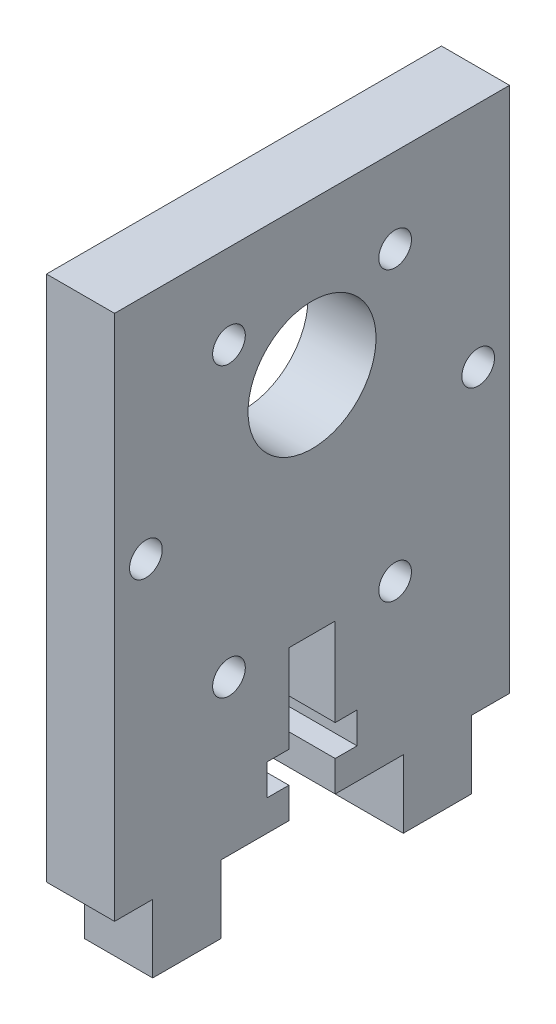
ISO-10303-21;
HEADER;
FILE_DESCRIPTION(('STEP AP214'),'2;1');
FILE_NAME('part.step','',(''),(''),'','','');
FILE_SCHEMA(('AUTOMOTIVE_DESIGN { 1 0 10303 214 1 1 1 1 }'));
ENDSEC;
DATA;
#1=APPLICATION_CONTEXT('core data for automotive mechanical design processes');
#2=APPLICATION_PROTOCOL_DEFINITION('international standard','automotive_design',2000,#1);
#3=PRODUCT_CONTEXT('',#1,'mechanical');
#4=PRODUCT('Part','Part','',(#3));
#5=PRODUCT_RELATED_PRODUCT_CATEGORY('part','',(#4));
#6=PRODUCT_DEFINITION_FORMATION('','',#4);
#7=PRODUCT_DEFINITION_CONTEXT('part definition',#1,'design');
#8=PRODUCT_DEFINITION('design','',#6,#7);
#9=PRODUCT_DEFINITION_SHAPE('','',#8);
#10=(LENGTH_UNIT() NAMED_UNIT(*) SI_UNIT(.MILLI.,.METRE.));
#11=(NAMED_UNIT(*) PLANE_ANGLE_UNIT() SI_UNIT($,.RADIAN.));
#12=(NAMED_UNIT(*) SI_UNIT($,.STERADIAN.) SOLID_ANGLE_UNIT());
#13=UNCERTAINTY_MEASURE_WITH_UNIT(LENGTH_MEASURE(1.E-05),#10,'distance_accuracy_value','');
#14=(GEOMETRIC_REPRESENTATION_CONTEXT(3) GLOBAL_UNCERTAINTY_ASSIGNED_CONTEXT((#13)) GLOBAL_UNIT_ASSIGNED_CONTEXT((#10,
#11,#12)) REPRESENTATION_CONTEXT('',''));
#15=CARTESIAN_POINT('',(0.,0.,0.));
#16=DIRECTION('',(0.,0.,1.));
#17=DIRECTION('',(1.,0.,0.));
#18=AXIS2_PLACEMENT_3D('',#15,#16,#17);
#19=CARTESIAN_POINT('',(6.35,-24.5525988031179,0.));
#20=DIRECTION('',(0.,-1.,0.));
#21=DIRECTION('',(0.,0.,-1.));
#22=AXIS2_PLACEMENT_3D('',#19,#20,#21);
#23=PLANE('',#22);
#24=DIRECTION('',(0.,0.,1.));
#25=VECTOR('',#24,1.);
#26=CARTESIAN_POINT('',(0.,-24.5525988031179,0.));
#27=LINE('',#26,#25);
#28=CARTESIAN_POINT('',(0.,-24.5525988031179,-8.50899999999945));
#29=VERTEX_POINT('',#28);
#30=CARTESIAN_POINT('',(0.,-24.5525988031179,-2.15899999999948));
#31=VERTEX_POINT('',#30);
#32=EDGE_CURVE('E288',#29,#31,#27,.T.);
#33=ORIENTED_EDGE('',*,*,#32,.F.);
#34=DIRECTION('',(-1.,0.,0.));
#35=VECTOR('',#34,1.);
#36=CARTESIAN_POINT('',(6.35,-24.5525988031179,-8.50899999999945));
#37=LINE('',#36,#35);
#38=CARTESIAN_POINT('',(6.35,-24.5525988031179,-8.50899999999945));
#39=VERTEX_POINT('',#38);
#40=EDGE_CURVE('E11',#39,#29,#37,.T.);
#41=ORIENTED_EDGE('',*,*,#40,.F.);
#42=DIRECTION('',(0.,0.,1.));
#43=VECTOR('',#42,1.);
#44=CARTESIAN_POINT('',(6.35,-24.5525988031179,0.));
#45=LINE('',#44,#43);
#46=CARTESIAN_POINT('',(6.35,-24.5525988031179,-2.15899999999948));
#47=VERTEX_POINT('',#46);
#48=EDGE_CURVE('E510',#39,#47,#45,.T.);
#49=ORIENTED_EDGE('',*,*,#48,.T.);
#50=DIRECTION('',(-1.,0.,0.));
#51=VECTOR('',#50,1.);
#52=CARTESIAN_POINT('',(6.35,-24.5525988031179,-2.15899999999948));
#53=LINE('',#52,#51);
#54=EDGE_CURVE('E133',#47,#31,#53,.T.);
#55=ORIENTED_EDGE('',*,*,#54,.T.);
#56=EDGE_LOOP('',(#33,#41,#49,#55));
#57=FACE_BOUND('',#56,.T.);
#58=ADVANCED_FACE('F34',(#57),#23,.T.);
#59=CARTESIAN_POINT('',(6.35,0.,-8.50899999999945));
#60=DIRECTION('',(0.,0.,-1.));
#61=DIRECTION('',(0.,1.,0.));
#62=AXIS2_PLACEMENT_3D('',#59,#60,#61);
#63=PLANE('',#62);
#64=DIRECTION('',(0.,-1.,0.));
#65=VECTOR('',#64,1.);
#66=CARTESIAN_POINT('',(0.,0.,-8.50899999999945));
#67=LINE('',#66,#65);
#68=CARTESIAN_POINT('',(0.,-30.9025988031179,-8.50899999999944));
#69=VERTEX_POINT('',#68);
#70=EDGE_CURVE('E286',#29,#69,#67,.T.);
#71=ORIENTED_EDGE('',*,*,#70,.T.);
#72=DIRECTION('',(-1.,0.,0.));
#73=VECTOR('',#72,1.);
#74=CARTESIAN_POINT('',(6.35,-30.9025988031179,-8.50899999999944));
#75=LINE('',#74,#73);
#76=CARTESIAN_POINT('',(6.35,-30.9025988031179,-8.50899999999944));
#77=VERTEX_POINT('',#76);
#78=EDGE_CURVE('E43',#77,#69,#75,.T.);
#79=ORIENTED_EDGE('',*,*,#78,.F.);
#80=DIRECTION('',(0.,-1.,0.));
#81=VECTOR('',#80,1.);
#82=CARTESIAN_POINT('',(6.35,0.,-8.50899999999945));
#83=LINE('',#82,#81);
#84=EDGE_CURVE('E512',#39,#77,#83,.T.);
#85=ORIENTED_EDGE('',*,*,#84,.F.);
#86=ORIENTED_EDGE('',*,*,#40,.T.);
#87=EDGE_LOOP('',(#71,#79,#85,#86));
#88=FACE_BOUND('',#87,.T.);
#89=ADVANCED_FACE('F287',(#88),#63,.F.);
#90=CARTESIAN_POINT('',(6.35,-30.9025988031179,0.));
#91=DIRECTION('',(0.,1.,0.));
#92=DIRECTION('',(0.,0.,1.));
#93=AXIS2_PLACEMENT_3D('',#90,#91,#92);
#94=PLANE('',#93);
#95=DIRECTION('',(0.,0.,-1.));
#96=VECTOR('',#95,1.);
#97=CARTESIAN_POINT('',(0.,-30.9025988031179,0.));
#98=LINE('',#97,#96);
#99=CARTESIAN_POINT('',(0.,-30.9025988031179,-14.8589999999995));
#100=VERTEX_POINT('',#99);
#101=EDGE_CURVE('E280',#69,#100,#98,.T.);
#102=ORIENTED_EDGE('',*,*,#101,.T.);
#103=DIRECTION('',(-1.,0.,0.));
#104=VECTOR('',#103,1.);
#105=CARTESIAN_POINT('',(6.35,-30.9025988031179,-14.8589999999995));
#106=LINE('',#105,#104);
#107=CARTESIAN_POINT('',(6.35,-30.9025988031179,-14.8589999999995));
#108=VERTEX_POINT('',#107);
#109=EDGE_CURVE('E271',#108,#100,#106,.T.);
#110=ORIENTED_EDGE('',*,*,#109,.F.);
#111=DIRECTION('',(0.,0.,-1.));
#112=VECTOR('',#111,1.);
#113=CARTESIAN_POINT('',(6.35,-30.9025988031179,0.));
#114=LINE('',#113,#112);
#115=EDGE_CURVE('E282',#77,#108,#114,.T.);
#116=ORIENTED_EDGE('',*,*,#115,.F.);
#117=ORIENTED_EDGE('',*,*,#78,.T.);
#118=EDGE_LOOP('',(#102,#110,#116,#117));
#119=FACE_BOUND('',#118,.T.);
#120=ADVANCED_FACE('F278',(#119),#94,.F.);
#121=CARTESIAN_POINT('',(6.35,0.,-14.8589999999995));
#122=DIRECTION('',(0.,0.,1.));
#123=DIRECTION('',(0.,-1.,0.));
#124=AXIS2_PLACEMENT_3D('',#121,#122,#123);
#125=PLANE('',#124);
#126=DIRECTION('',(0.,1.,0.));
#127=VECTOR('',#126,1.);
#128=CARTESIAN_POINT('',(0.,0.,-14.8589999999995));
#129=LINE('',#128,#127);
#130=CARTESIAN_POINT('',(0.,-24.5525988031179,-14.8589999999995));
#131=VERTEX_POINT('',#130);
#132=EDGE_CURVE('E290',#100,#131,#129,.T.);
#133=ORIENTED_EDGE('',*,*,#132,.T.);
#134=DIRECTION('',(-1.,0.,0.));
#135=VECTOR('',#134,1.);
#136=CARTESIAN_POINT('',(6.35,-24.5525988031179,-14.8589999999995));
#137=LINE('',#136,#135);
#138=CARTESIAN_POINT('',(6.35,-24.5525988031179,-14.8589999999995));
#139=VERTEX_POINT('',#138);
#140=EDGE_CURVE('E268',#139,#131,#137,.T.);
#141=ORIENTED_EDGE('',*,*,#140,.F.);
#142=DIRECTION('',(0.,1.,0.));
#143=VECTOR('',#142,1.);
#144=CARTESIAN_POINT('',(6.35,0.,-14.8589999999995));
#145=LINE('',#144,#143);
#146=EDGE_CURVE('E519',#108,#139,#145,.T.);
#147=ORIENTED_EDGE('',*,*,#146,.F.);
#148=ORIENTED_EDGE('',*,*,#109,.T.);
#149=EDGE_LOOP('',(#133,#141,#147,#148));
#150=FACE_BOUND('',#149,.T.);
#151=ADVANCED_FACE('F400',(#150),#125,.F.);
#152=CARTESIAN_POINT('',(6.35,-24.5525988031179,0.));
#153=DIRECTION('',(0.,1.,0.));
#154=DIRECTION('',(0.,0.,1.));
#155=AXIS2_PLACEMENT_3D('',#152,#153,#154);
#156=PLANE('',#155);
#157=DIRECTION('',(0.,0.,-1.));
#158=VECTOR('',#157,1.);
#159=CARTESIAN_POINT('',(0.,-24.5525988031179,0.));
#160=LINE('',#159,#158);
#161=CARTESIAN_POINT('',(0.,-24.5525988031179,-18.415));
#162=VERTEX_POINT('',#161);
#163=EDGE_CURVE('E298',#131,#162,#160,.T.);
#164=ORIENTED_EDGE('',*,*,#163,.T.);
#165=DIRECTION('',(-1.,0.,0.));
#166=VECTOR('',#165,1.);
#167=CARTESIAN_POINT('',(6.35,-24.5525988031179,-18.415));
#168=LINE('',#167,#166);
#169=CARTESIAN_POINT('',(6.35,-24.5525988031179,-18.415));
#170=VERTEX_POINT('',#169);
#171=EDGE_CURVE('E265',#170,#162,#168,.T.);
#172=ORIENTED_EDGE('',*,*,#171,.F.);
#173=DIRECTION('',(0.,0.,-1.));
#174=VECTOR('',#173,1.);
#175=CARTESIAN_POINT('',(6.35,-24.5525988031179,0.));
#176=LINE('',#175,#174);
#177=EDGE_CURVE('E522',#139,#170,#176,.T.);
#178=ORIENTED_EDGE('',*,*,#177,.F.);
#179=ORIENTED_EDGE('',*,*,#140,.T.);
#180=EDGE_LOOP('',(#164,#172,#178,#179));
#181=FACE_BOUND('',#180,.T.);
#182=ADVANCED_FACE('F403',(#181),#156,.F.);
#183=CARTESIAN_POINT('',(6.35,0.,-18.415));
#184=DIRECTION('',(0.,0.,1.));
#185=DIRECTION('',(0.,-1.,0.));
#186=AXIS2_PLACEMENT_3D('',#183,#184,#185);
#187=PLANE('',#186);
#188=DIRECTION('',(0.,1.,0.));
#189=VECTOR('',#188,1.);
#190=CARTESIAN_POINT('',(0.,0.,-18.415));
#191=LINE('',#190,#189);
#192=CARTESIAN_POINT('',(0.,24.5525988031181,-18.415));
#193=VERTEX_POINT('',#192);
#194=EDGE_CURVE('E301',#162,#193,#191,.T.);
#195=ORIENTED_EDGE('',*,*,#194,.T.);
#196=DIRECTION('',(-1.,0.,0.));
#197=VECTOR('',#196,1.);
#198=CARTESIAN_POINT('',(6.35,24.5525988031181,-18.415));
#199=LINE('',#198,#197);
#200=CARTESIAN_POINT('',(6.35,24.5525988031181,-18.415));
#201=VERTEX_POINT('',#200);
#202=EDGE_CURVE('E263',#201,#193,#199,.T.);
#203=ORIENTED_EDGE('',*,*,#202,.F.);
#204=DIRECTION('',(0.,1.,0.));
#205=VECTOR('',#204,1.);
#206=CARTESIAN_POINT('',(6.35,0.,-18.415));
#207=LINE('',#206,#205);
#208=EDGE_CURVE('E525',#170,#201,#207,.T.);
#209=ORIENTED_EDGE('',*,*,#208,.F.);
#210=ORIENTED_EDGE('',*,*,#171,.T.);
#211=EDGE_LOOP('',(#195,#203,#209,#210));
#212=FACE_BOUND('',#211,.T.);
#213=ADVANCED_FACE('F407',(#212),#187,.F.);
#214=CARTESIAN_POINT('',(6.35,24.5525988031181,0.));
#215=DIRECTION('',(0.,1.,0.));
#216=DIRECTION('',(0.,0.,1.));
#217=AXIS2_PLACEMENT_3D('',#214,#215,#216);
#218=PLANE('',#217);
#219=DIRECTION('',(0.,0.,-1.));
#220=VECTOR('',#219,1.);
#221=CARTESIAN_POINT('',(0.,24.5525988031181,0.));
#222=LINE('',#221,#220);
#223=CARTESIAN_POINT('',(0.,24.5525988031181,18.415));
#224=VERTEX_POINT('',#223);
#225=EDGE_CURVE('E304',#224,#193,#222,.T.);
#226=ORIENTED_EDGE('',*,*,#225,.F.);
#227=DIRECTION('',(-1.,0.,0.));
#228=VECTOR('',#227,1.);
#229=CARTESIAN_POINT('',(6.35,24.5525988031181,18.415));
#230=LINE('',#229,#228);
#231=CARTESIAN_POINT('',(6.35,24.5525988031181,18.415));
#232=VERTEX_POINT('',#231);
#233=EDGE_CURVE('E261',#232,#224,#230,.T.);
#234=ORIENTED_EDGE('',*,*,#233,.F.);
#235=DIRECTION('',(0.,0.,-1.));
#236=VECTOR('',#235,1.);
#237=CARTESIAN_POINT('',(6.35,24.5525988031181,0.));
#238=LINE('',#237,#236);
#239=EDGE_CURVE('E527',#232,#201,#238,.T.);
#240=ORIENTED_EDGE('',*,*,#239,.T.);
#241=ORIENTED_EDGE('',*,*,#202,.T.);
#242=EDGE_LOOP('',(#226,#234,#240,#241));
#243=FACE_BOUND('',#242,.T.);
#244=ADVANCED_FACE('F411',(#243),#218,.T.);
#245=CARTESIAN_POINT('',(6.35,0.,18.415));
#246=DIRECTION('',(0.,0.,1.));
#247=DIRECTION('',(1.,0.,0.));
#248=AXIS2_PLACEMENT_3D('',#245,#246,#247);
#249=PLANE('',#248);
#250=DIRECTION('',(0.,1.,0.));
#251=VECTOR('',#250,1.);
#252=CARTESIAN_POINT('',(0.,0.,18.415));
#253=LINE('',#252,#251);
#254=CARTESIAN_POINT('',(0.,-24.5525988031179,18.415));
#255=VERTEX_POINT('',#254);
#256=EDGE_CURVE('E307',#255,#224,#253,.T.);
#257=ORIENTED_EDGE('',*,*,#256,.F.);
#258=DIRECTION('',(-1.,0.,0.));
#259=VECTOR('',#258,1.);
#260=CARTESIAN_POINT('',(6.35,-24.5525988031179,18.415));
#261=LINE('',#260,#259);
#262=CARTESIAN_POINT('',(6.35,-24.5525988031179,18.415));
#263=VERTEX_POINT('',#262);
#264=EDGE_CURVE('E259',#263,#255,#261,.T.);
#265=ORIENTED_EDGE('',*,*,#264,.F.);
#266=DIRECTION('',(0.,1.,0.));
#267=VECTOR('',#266,1.);
#268=CARTESIAN_POINT('',(6.35,0.,18.415));
#269=LINE('',#268,#267);
#270=EDGE_CURVE('E530',#263,#232,#269,.T.);
#271=ORIENTED_EDGE('',*,*,#270,.T.);
#272=ORIENTED_EDGE('',*,*,#233,.T.);
#273=EDGE_LOOP('',(#257,#265,#271,#272));
#274=FACE_BOUND('',#273,.T.);
#275=ADVANCED_FACE('F415',(#274),#249,.T.);
#276=CARTESIAN_POINT('',(6.35,-24.5525988031187,1.10192947066403E-12));
#277=DIRECTION('',(0.,1.,0.));
#278=DIRECTION('',(0.,0.,1.));
#279=AXIS2_PLACEMENT_3D('',#276,#277,#278);
#280=PLANE('',#279);
#281=DIRECTION('',(0.,0.,-1.));
#282=VECTOR('',#281,1.);
#283=CARTESIAN_POINT('',(0.,-24.5525988031187,1.10192947066403E-12));
#284=LINE('',#283,#282);
#285=CARTESIAN_POINT('',(0.,-24.552598803118,14.8590000000003));
#286=VERTEX_POINT('',#285);
#287=EDGE_CURVE('E310',#255,#286,#284,.T.);
#288=ORIENTED_EDGE('',*,*,#287,.T.);
#289=DIRECTION('',(-1.,0.,0.));
#290=VECTOR('',#289,1.);
#291=CARTESIAN_POINT('',(6.35,-24.552598803118,14.8590000000003));
#292=LINE('',#291,#290);
#293=CARTESIAN_POINT('',(6.35,-24.552598803118,14.8590000000003));
#294=VERTEX_POINT('',#293);
#295=EDGE_CURVE('E257',#294,#286,#292,.T.);
#296=ORIENTED_EDGE('',*,*,#295,.F.);
#297=DIRECTION('',(0.,0.,-1.));
#298=VECTOR('',#297,1.);
#299=CARTESIAN_POINT('',(6.35,-24.5525988031187,1.10192947066403E-12));
#300=LINE('',#299,#298);
#301=EDGE_CURVE('E533',#263,#294,#300,.T.);
#302=ORIENTED_EDGE('',*,*,#301,.F.);
#303=ORIENTED_EDGE('',*,*,#264,.T.);
#304=EDGE_LOOP('',(#288,#296,#302,#303));
#305=FACE_BOUND('',#304,.T.);
#306=ADVANCED_FACE('F419',(#305),#280,.F.);
#307=CARTESIAN_POINT('',(6.35,0.,14.8590000000006));
#308=DIRECTION('',(0.,0.,1.));
#309=DIRECTION('',(0.,-1.,0.));
#310=AXIS2_PLACEMENT_3D('',#307,#308,#309);
#311=PLANE('',#310);
#312=DIRECTION('',(0.,1.,0.));
#313=VECTOR('',#312,1.);
#314=CARTESIAN_POINT('',(0.,0.,14.8590000000006));
#315=LINE('',#314,#313);
#316=CARTESIAN_POINT('',(0.,-30.9025988031179,14.8590000000006));
#317=VERTEX_POINT('',#316);
#318=EDGE_CURVE('E313',#317,#286,#315,.T.);
#319=ORIENTED_EDGE('',*,*,#318,.F.);
#320=DIRECTION('',(-1.,0.,0.));
#321=VECTOR('',#320,1.);
#322=CARTESIAN_POINT('',(6.35,-30.9025988031179,14.8590000000006));
#323=LINE('',#322,#321);
#324=CARTESIAN_POINT('',(6.35,-30.9025988031179,14.8590000000006));
#325=VERTEX_POINT('',#324);
#326=EDGE_CURVE('E255',#325,#317,#323,.T.);
#327=ORIENTED_EDGE('',*,*,#326,.F.);
#328=DIRECTION('',(0.,1.,0.));
#329=VECTOR('',#328,1.);
#330=CARTESIAN_POINT('',(6.35,0.,14.8590000000006));
#331=LINE('',#330,#329);
#332=EDGE_CURVE('E535',#325,#294,#331,.T.);
#333=ORIENTED_EDGE('',*,*,#332,.T.);
#334=ORIENTED_EDGE('',*,*,#295,.T.);
#335=EDGE_LOOP('',(#319,#327,#333,#334));
#336=FACE_BOUND('',#335,.T.);
#337=ADVANCED_FACE('F423',(#336),#311,.T.);
#338=CARTESIAN_POINT('',(6.35,-30.9025988031179,0.));
#339=DIRECTION('',(0.,-1.,0.));
#340=DIRECTION('',(0.,0.,-1.));
#341=AXIS2_PLACEMENT_3D('',#338,#339,#340);
#342=PLANE('',#341);
#343=DIRECTION('',(0.,0.,1.));
#344=VECTOR('',#343,1.);
#345=CARTESIAN_POINT('',(0.,-30.9025988031179,0.));
#346=LINE('',#345,#344);
#347=CARTESIAN_POINT('',(0.,-30.9025988031179,8.50900000000058));
#348=VERTEX_POINT('',#347);
#349=EDGE_CURVE('E316',#348,#317,#346,.T.);
#350=ORIENTED_EDGE('',*,*,#349,.F.);
#351=DIRECTION('',(-1.,0.,0.));
#352=VECTOR('',#351,1.);
#353=CARTESIAN_POINT('',(6.35,-30.9025988031179,8.50900000000058));
#354=LINE('',#353,#352);
#355=CARTESIAN_POINT('',(6.35,-30.9025988031179,8.50900000000058));
#356=VERTEX_POINT('',#355);
#357=EDGE_CURVE('E253',#356,#348,#354,.T.);
#358=ORIENTED_EDGE('',*,*,#357,.F.);
#359=DIRECTION('',(0.,0.,1.));
#360=VECTOR('',#359,1.);
#361=CARTESIAN_POINT('',(6.35,-30.9025988031179,0.));
#362=LINE('',#361,#360);
#363=EDGE_CURVE('E538',#356,#325,#362,.T.);
#364=ORIENTED_EDGE('',*,*,#363,.T.);
#365=ORIENTED_EDGE('',*,*,#326,.T.);
#366=EDGE_LOOP('',(#350,#358,#364,#365));
#367=FACE_BOUND('',#366,.T.);
#368=ADVANCED_FACE('F427',(#367),#342,.T.);
#369=CARTESIAN_POINT('',(6.35,0.,8.50900000000059));
#370=DIRECTION('',(0.,0.,-1.));
#371=DIRECTION('',(0.,1.,0.));
#372=AXIS2_PLACEMENT_3D('',#369,#370,#371);
#373=PLANE('',#372);
#374=DIRECTION('',(0.,-1.,0.));
#375=VECTOR('',#374,1.);
#376=CARTESIAN_POINT('',(0.,0.,8.50900000000059));
#377=LINE('',#376,#375);
#378=CARTESIAN_POINT('',(0.,-24.5525988031179,8.50900000000058));
#379=VERTEX_POINT('',#378);
#380=EDGE_CURVE('E319',#379,#348,#377,.T.);
#381=ORIENTED_EDGE('',*,*,#380,.F.);
#382=DIRECTION('',(-1.,0.,0.));
#383=VECTOR('',#382,1.);
#384=CARTESIAN_POINT('',(6.35,-24.5525988031179,8.50900000000058));
#385=LINE('',#384,#383);
#386=CARTESIAN_POINT('',(6.35,-24.5525988031179,8.50900000000058));
#387=VERTEX_POINT('',#386);
#388=EDGE_CURVE('E251',#387,#379,#385,.T.);
#389=ORIENTED_EDGE('',*,*,#388,.F.);
#390=DIRECTION('',(0.,-1.,0.));
#391=VECTOR('',#390,1.);
#392=CARTESIAN_POINT('',(6.35,0.,8.50900000000059));
#393=LINE('',#392,#391);
#394=EDGE_CURVE('E541',#387,#356,#393,.T.);
#395=ORIENTED_EDGE('',*,*,#394,.T.);
#396=ORIENTED_EDGE('',*,*,#357,.T.);
#397=EDGE_LOOP('',(#381,#389,#395,#396));
#398=FACE_BOUND('',#397,.T.);
#399=ADVANCED_FACE('F431',(#398),#373,.T.);
#400=CARTESIAN_POINT('',(6.35,-24.5525988031179,0.));
#401=DIRECTION('',(0.,1.,0.));
#402=DIRECTION('',(0.,0.,1.));
#403=AXIS2_PLACEMENT_3D('',#400,#401,#402);
#404=PLANE('',#403);
#405=DIRECTION('',(0.,0.,-1.));
#406=VECTOR('',#405,1.);
#407=CARTESIAN_POINT('',(0.,-24.5525988031179,0.));
#408=LINE('',#407,#406);
#409=CARTESIAN_POINT('',(0.,-24.5525988031179,2.15900000000058));
#410=VERTEX_POINT('',#409);
#411=EDGE_CURVE('E322',#379,#410,#408,.T.);
#412=ORIENTED_EDGE('',*,*,#411,.T.);
#413=DIRECTION('',(-1.,0.,0.));
#414=VECTOR('',#413,1.);
#415=CARTESIAN_POINT('',(6.35,-24.5525988031179,2.15900000000058));
#416=LINE('',#415,#414);
#417=CARTESIAN_POINT('',(6.35,-24.5525988031179,2.15900000000058));
#418=VERTEX_POINT('',#417);
#419=EDGE_CURVE('E248',#418,#410,#416,.T.);
#420=ORIENTED_EDGE('',*,*,#419,.F.);
#421=DIRECTION('',(0.,0.,-1.));
#422=VECTOR('',#421,1.);
#423=CARTESIAN_POINT('',(6.35,-24.5525988031179,0.));
#424=LINE('',#423,#422);
#425=EDGE_CURVE('E544',#387,#418,#424,.T.);
#426=ORIENTED_EDGE('',*,*,#425,.F.);
#427=ORIENTED_EDGE('',*,*,#388,.T.);
#428=EDGE_LOOP('',(#412,#420,#426,#427));
#429=FACE_BOUND('',#428,.T.);
#430=ADVANCED_FACE('F435',(#429),#404,.F.);
#431=CARTESIAN_POINT('',(6.35,0.,2.15900000000043));
#432=DIRECTION('',(0.,0.,1.));
#433=DIRECTION('',(0.,-1.,0.));
#434=AXIS2_PLACEMENT_3D('',#431,#432,#433);
#435=PLANE('',#434);
#436=DIRECTION('',(0.,1.,0.));
#437=VECTOR('',#436,1.);
#438=CARTESIAN_POINT('',(0.,0.,2.15900000000043));
#439=LINE('',#438,#437);
#440=CARTESIAN_POINT('',(0.,-21.6848958213471,2.15900000000057));
#441=VERTEX_POINT('',#440);
#442=EDGE_CURVE('E325',#410,#441,#439,.T.);
#443=ORIENTED_EDGE('',*,*,#442,.T.);
#444=DIRECTION('',(-1.,0.,0.));
#445=VECTOR('',#444,1.);
#446=CARTESIAN_POINT('',(6.35,-21.6848958213471,2.15900000000057));
#447=LINE('',#446,#445);
#448=CARTESIAN_POINT('',(6.35,-21.6848958213471,2.15900000000057));
#449=VERTEX_POINT('',#448);
#450=EDGE_CURVE('E245',#449,#441,#447,.T.);
#451=ORIENTED_EDGE('',*,*,#450,.F.);
#452=DIRECTION('',(0.,1.,0.));
#453=VECTOR('',#452,1.);
#454=CARTESIAN_POINT('',(6.35,0.,2.15900000000043));
#455=LINE('',#454,#453);
#456=EDGE_CURVE('E547',#418,#449,#455,.T.);
#457=ORIENTED_EDGE('',*,*,#456,.F.);
#458=ORIENTED_EDGE('',*,*,#419,.T.);
#459=EDGE_LOOP('',(#443,#451,#457,#458));
#460=FACE_BOUND('',#459,.T.);
#461=ADVANCED_FACE('F439',(#460),#435,.F.);
#462=CARTESIAN_POINT('',(6.35,-21.6848958213471,0.));
#463=DIRECTION('',(0.,-1.,0.));
#464=DIRECTION('',(0.,0.,-1.));
#465=AXIS2_PLACEMENT_3D('',#462,#463,#464);
#466=PLANE('',#465);
#467=DIRECTION('',(0.,0.,1.));
#468=VECTOR('',#467,1.);
#469=CARTESIAN_POINT('',(0.,-21.6848958213471,0.));
#470=LINE('',#469,#468);
#471=CARTESIAN_POINT('',(0.,-21.6848958213471,4.19999998200053));
#472=VERTEX_POINT('',#471);
#473=EDGE_CURVE('E328',#441,#472,#470,.T.);
#474=ORIENTED_EDGE('',*,*,#473,.T.);
#475=DIRECTION('',(-1.,0.,0.));
#476=VECTOR('',#475,1.);
#477=CARTESIAN_POINT('',(6.35,-21.6848958213471,4.19999998200053));
#478=LINE('',#477,#476);
#479=CARTESIAN_POINT('',(6.35,-21.6848958213471,4.19999998200053));
#480=VERTEX_POINT('',#479);
#481=EDGE_CURVE('E242',#480,#472,#478,.T.);
#482=ORIENTED_EDGE('',*,*,#481,.F.);
#483=DIRECTION('',(0.,0.,1.));
#484=VECTOR('',#483,1.);
#485=CARTESIAN_POINT('',(6.35,-21.6848958213471,0.));
#486=LINE('',#485,#484);
#487=EDGE_CURVE('E550',#449,#480,#486,.T.);
#488=ORIENTED_EDGE('',*,*,#487,.F.);
#489=ORIENTED_EDGE('',*,*,#450,.T.);
#490=EDGE_LOOP('',(#474,#482,#488,#489));
#491=FACE_BOUND('',#490,.T.);
#492=ADVANCED_FACE('F443',(#491),#466,.F.);
#493=CARTESIAN_POINT('',(6.35,0.,4.19999998200053));
#494=DIRECTION('',(0.,0.,1.));
#495=DIRECTION('',(1.,0.,0.));
#496=AXIS2_PLACEMENT_3D('',#493,#494,#495);
#497=PLANE('',#496);
#498=DIRECTION('',(0.,1.,0.));
#499=VECTOR('',#498,1.);
#500=CARTESIAN_POINT('',(0.,0.,4.19999998200053));
#501=LINE('',#500,#499);
#502=CARTESIAN_POINT('',(0.,-18.7848957793471,4.19999998200053));
#503=VERTEX_POINT('',#502);
#504=EDGE_CURVE('E331',#472,#503,#501,.T.);
#505=ORIENTED_EDGE('',*,*,#504,.T.);
#506=DIRECTION('',(-1.,0.,0.));
#507=VECTOR('',#506,1.);
#508=CARTESIAN_POINT('',(6.35,-18.7848957793471,4.19999998200053));
#509=LINE('',#508,#507);
#510=CARTESIAN_POINT('',(6.35,-18.7848957793471,4.19999998200053));
#511=VERTEX_POINT('',#510);
#512=EDGE_CURVE('E239',#511,#503,#509,.T.);
#513=ORIENTED_EDGE('',*,*,#512,.F.);
#514=DIRECTION('',(0.,1.,0.));
#515=VECTOR('',#514,1.);
#516=CARTESIAN_POINT('',(6.35,0.,4.19999998200053));
#517=LINE('',#516,#515);
#518=EDGE_CURVE('E553',#480,#511,#517,.T.);
#519=ORIENTED_EDGE('',*,*,#518,.F.);
#520=ORIENTED_EDGE('',*,*,#481,.T.);
#521=EDGE_LOOP('',(#505,#513,#519,#520));
#522=FACE_BOUND('',#521,.T.);
#523=ADVANCED_FACE('F447',(#522),#497,.F.);
#524=CARTESIAN_POINT('',(6.35,-18.784895779347,0.));
#525=DIRECTION('',(0.,1.,0.));
#526=DIRECTION('',(0.,0.,1.));
#527=AXIS2_PLACEMENT_3D('',#524,#525,#526);
#528=PLANE('',#527);
#529=DIRECTION('',(0.,0.,-1.));
#530=VECTOR('',#529,1.);
#531=CARTESIAN_POINT('',(0.,-18.784895779347,0.));
#532=LINE('',#531,#530);
#533=CARTESIAN_POINT('',(0.,-18.784895779347,2.15900000000057));
#534=VERTEX_POINT('',#533);
#535=EDGE_CURVE('E334',#503,#534,#532,.T.);
#536=ORIENTED_EDGE('',*,*,#535,.T.);
#537=DIRECTION('',(-1.,0.,0.));
#538=VECTOR('',#537,1.);
#539=CARTESIAN_POINT('',(6.35,-18.784895779347,2.15900000000057));
#540=LINE('',#539,#538);
#541=CARTESIAN_POINT('',(6.35,-18.784895779347,2.15900000000057));
#542=VERTEX_POINT('',#541);
#543=EDGE_CURVE('E236',#542,#534,#540,.T.);
#544=ORIENTED_EDGE('',*,*,#543,.F.);
#545=DIRECTION('',(0.,0.,-1.));
#546=VECTOR('',#545,1.);
#547=CARTESIAN_POINT('',(6.35,-18.784895779347,0.));
#548=LINE('',#547,#546);
#549=EDGE_CURVE('E556',#511,#542,#548,.T.);
#550=ORIENTED_EDGE('',*,*,#549,.F.);
#551=ORIENTED_EDGE('',*,*,#512,.T.);
#552=EDGE_LOOP('',(#536,#544,#550,#551));
#553=FACE_BOUND('',#552,.T.);
#554=ADVANCED_FACE('F451',(#553),#528,.F.);
#555=CARTESIAN_POINT('',(6.35,0.,2.15900000000059));
#556=DIRECTION('',(0.,0.,1.));
#557=DIRECTION('',(0.,-1.,0.));
#558=AXIS2_PLACEMENT_3D('',#555,#556,#557);
#559=PLANE('',#558);
#560=DIRECTION('',(0.,1.,0.));
#561=VECTOR('',#560,1.);
#562=CARTESIAN_POINT('',(0.,0.,2.15900000000059));
#563=LINE('',#562,#561);
#564=CARTESIAN_POINT('',(0.,-10.5825988031179,2.15900000000058));
#565=VERTEX_POINT('',#564);
#566=EDGE_CURVE('E337',#534,#565,#563,.T.);
#567=ORIENTED_EDGE('',*,*,#566,.T.);
#568=DIRECTION('',(-1.,0.,0.));
#569=VECTOR('',#568,1.);
#570=CARTESIAN_POINT('',(6.35,-10.5825988031179,2.15900000000058));
#571=LINE('',#570,#569);
#572=CARTESIAN_POINT('',(6.35,-10.5825988031179,2.15900000000058));
#573=VERTEX_POINT('',#572);
#574=EDGE_CURVE('E233',#573,#565,#571,.T.);
#575=ORIENTED_EDGE('',*,*,#574,.F.);
#576=DIRECTION('',(0.,1.,0.));
#577=VECTOR('',#576,1.);
#578=CARTESIAN_POINT('',(6.35,0.,2.15900000000059));
#579=LINE('',#578,#577);
#580=EDGE_CURVE('E559',#542,#573,#579,.T.);
#581=ORIENTED_EDGE('',*,*,#580,.F.);
#582=ORIENTED_EDGE('',*,*,#543,.T.);
#583=EDGE_LOOP('',(#567,#575,#581,#582));
#584=FACE_BOUND('',#583,.T.);
#585=ADVANCED_FACE('F455',(#584),#559,.F.);
#586=CARTESIAN_POINT('',(6.35,-10.5825988031179,0.));
#587=DIRECTION('',(0.,1.,0.));
#588=DIRECTION('',(0.,0.,1.));
#589=AXIS2_PLACEMENT_3D('',#586,#587,#588);
#590=PLANE('',#589);
#591=DIRECTION('',(0.,0.,-1.));
#592=VECTOR('',#591,1.);
#593=CARTESIAN_POINT('',(0.,-10.5825988031179,0.));
#594=LINE('',#593,#592);
#595=CARTESIAN_POINT('',(0.,-10.5825988031179,-2.15899999999948));
#596=VERTEX_POINT('',#595);
#597=EDGE_CURVE('E340',#565,#596,#594,.T.);
#598=ORIENTED_EDGE('',*,*,#597,.T.);
#599=DIRECTION('',(-1.,0.,0.));
#600=VECTOR('',#599,1.);
#601=CARTESIAN_POINT('',(6.35,-10.5825988031179,-2.15899999999948));
#602=LINE('',#601,#600);
#603=CARTESIAN_POINT('',(6.35,-10.5825988031179,-2.15899999999948));
#604=VERTEX_POINT('',#603);
#605=EDGE_CURVE('E230',#604,#596,#602,.T.);
#606=ORIENTED_EDGE('',*,*,#605,.F.);
#607=DIRECTION('',(0.,0.,-1.));
#608=VECTOR('',#607,1.);
#609=CARTESIAN_POINT('',(6.35,-10.5825988031179,0.));
#610=LINE('',#609,#608);
#611=EDGE_CURVE('E562',#573,#604,#610,.T.);
#612=ORIENTED_EDGE('',*,*,#611,.F.);
#613=ORIENTED_EDGE('',*,*,#574,.T.);
#614=EDGE_LOOP('',(#598,#606,#612,#613));
#615=FACE_BOUND('',#614,.T.);
#616=ADVANCED_FACE('F459',(#615),#590,.F.);
#617=CARTESIAN_POINT('',(6.35,0.,-2.15899999999948));
#618=DIRECTION('',(0.,0.,-1.));
#619=DIRECTION('',(0.,1.,0.));
#620=AXIS2_PLACEMENT_3D('',#617,#618,#619);
#621=PLANE('',#620);
#622=DIRECTION('',(0.,-1.,0.));
#623=VECTOR('',#622,1.);
#624=CARTESIAN_POINT('',(0.,0.,-2.15899999999948));
#625=LINE('',#624,#623);
#626=CARTESIAN_POINT('',(0.,-18.7848957793471,-2.15899999999948));
#627=VERTEX_POINT('',#626);
#628=EDGE_CURVE('E343',#596,#627,#625,.T.);
#629=ORIENTED_EDGE('',*,*,#628,.T.);
#630=DIRECTION('',(-1.,0.,0.));
#631=VECTOR('',#630,1.);
#632=CARTESIAN_POINT('',(6.35,-18.7848957793471,-2.15899999999948));
#633=LINE('',#632,#631);
#634=CARTESIAN_POINT('',(6.35,-18.7848957793471,-2.15899999999948));
#635=VERTEX_POINT('',#634);
#636=EDGE_CURVE('E223',#635,#627,#633,.T.);
#637=ORIENTED_EDGE('',*,*,#636,.F.);
#638=DIRECTION('',(0.,-1.,0.));
#639=VECTOR('',#638,1.);
#640=CARTESIAN_POINT('',(6.35,0.,-2.15899999999948));
#641=LINE('',#640,#639);
#642=EDGE_CURVE('E565',#604,#635,#641,.T.);
#643=ORIENTED_EDGE('',*,*,#642,.F.);
#644=ORIENTED_EDGE('',*,*,#605,.T.);
#645=EDGE_LOOP('',(#629,#637,#643,#644));
#646=FACE_BOUND('',#645,.T.);
#647=ADVANCED_FACE('F463',(#646),#621,.F.);
#648=CARTESIAN_POINT('',(6.35,-18.7848957793471,0.));
#649=DIRECTION('',(0.,1.,0.));
#650=DIRECTION('',(0.,0.,1.));
#651=AXIS2_PLACEMENT_3D('',#648,#649,#650);
#652=PLANE('',#651);
#653=DIRECTION('',(0.,0.,-1.));
#654=VECTOR('',#653,1.);
#655=CARTESIAN_POINT('',(0.,-18.7848957793471,0.));
#656=LINE('',#655,#654);
#657=CARTESIAN_POINT('',(0.,-18.7848957793471,-4.19999998199945));
#658=VERTEX_POINT('',#657);
#659=EDGE_CURVE('E346',#627,#658,#656,.T.);
#660=ORIENTED_EDGE('',*,*,#659,.T.);
#661=DIRECTION('',(-1.,0.,0.));
#662=VECTOR('',#661,1.);
#663=CARTESIAN_POINT('',(6.35,-18.7848957793471,-4.19999998199945));
#664=LINE('',#663,#662);
#665=CARTESIAN_POINT('',(6.35,-18.7848957793471,-4.19999998199945));
#666=VERTEX_POINT('',#665);
#667=EDGE_CURVE('E221',#666,#658,#664,.T.);
#668=ORIENTED_EDGE('',*,*,#667,.F.);
#669=DIRECTION('',(0.,0.,-1.));
#670=VECTOR('',#669,1.);
#671=CARTESIAN_POINT('',(6.35,-18.7848957793471,0.));
#672=LINE('',#671,#670);
#673=EDGE_CURVE('E214',#635,#666,#672,.T.);
#674=ORIENTED_EDGE('',*,*,#673,.F.);
#675=ORIENTED_EDGE('',*,*,#636,.T.);
#676=EDGE_LOOP('',(#660,#668,#674,#675));
#677=FACE_BOUND('',#676,.T.);
#678=ADVANCED_FACE('F467',(#677),#652,.F.);
#679=CARTESIAN_POINT('',(6.35,0.,-4.19999998199945));
#680=DIRECTION('',(0.,0.,-1.));
#681=DIRECTION('',(-1.,0.,0.));
#682=AXIS2_PLACEMENT_3D('',#679,#680,#681);
#683=PLANE('',#682);
#684=DIRECTION('',(0.,-1.,0.));
#685=VECTOR('',#684,1.);
#686=CARTESIAN_POINT('',(0.,0.,-4.19999998199945));
#687=LINE('',#686,#685);
#688=CARTESIAN_POINT('',(0.,-21.6848958213471,-4.19999998199945));
#689=VERTEX_POINT('',#688);
#690=EDGE_CURVE('E220',#658,#689,#687,.T.);
#691=ORIENTED_EDGE('',*,*,#690,.T.);
#692=DIRECTION('',(-1.,0.,0.));
#693=VECTOR('',#692,1.);
#694=CARTESIAN_POINT('',(6.35,-21.6848958213471,-4.19999998199945));
#695=LINE('',#694,#693);
#696=CARTESIAN_POINT('',(6.35,-21.6848958213471,-4.19999998199945));
#697=VERTEX_POINT('',#696);
#698=EDGE_CURVE('E206',#697,#689,#695,.T.);
#699=ORIENTED_EDGE('',*,*,#698,.F.);
#700=DIRECTION('',(0.,-1.,0.));
#701=VECTOR('',#700,1.);
#702=CARTESIAN_POINT('',(6.35,0.,-4.19999998199945));
#703=LINE('',#702,#701);
#704=EDGE_CURVE('E209',#666,#697,#703,.T.);
#705=ORIENTED_EDGE('',*,*,#704,.F.);
#706=ORIENTED_EDGE('',*,*,#667,.T.);
#707=EDGE_LOOP('',(#691,#699,#705,#706));
#708=FACE_BOUND('',#707,.T.);
#709=ADVANCED_FACE('F219',(#708),#683,.F.);
#710=CARTESIAN_POINT('',(6.35,-21.6848958213471,0.));
#711=DIRECTION('',(0.,-1.,0.));
#712=DIRECTION('',(0.,0.,-1.));
#713=AXIS2_PLACEMENT_3D('',#710,#711,#712);
#714=PLANE('',#713);
#715=DIRECTION('',(0.,0.,1.));
#716=VECTOR('',#715,1.);
#717=CARTESIAN_POINT('',(0.,-21.6848958213471,0.));
#718=LINE('',#717,#716);
#719=CARTESIAN_POINT('',(0.,-21.6848958213471,-2.15899999999948));
#720=VERTEX_POINT('',#719);
#721=EDGE_CURVE('E350',#689,#720,#718,.T.);
#722=ORIENTED_EDGE('',*,*,#721,.T.);
#723=DIRECTION('',(-1.,0.,0.));
#724=VECTOR('',#723,1.);
#725=CARTESIAN_POINT('',(6.35,-21.6848958213471,-2.15899999999948));
#726=LINE('',#725,#724);
#727=CARTESIAN_POINT('',(6.35,-21.6848958213471,-2.15899999999948));
#728=VERTEX_POINT('',#727);
#729=EDGE_CURVE('E208',#728,#720,#726,.T.);
#730=ORIENTED_EDGE('',*,*,#729,.F.);
#731=DIRECTION('',(0.,0.,1.));
#732=VECTOR('',#731,1.);
#733=CARTESIAN_POINT('',(6.35,-21.6848958213471,0.));
#734=LINE('',#733,#732);
#735=EDGE_CURVE('E201',#697,#728,#734,.T.);
#736=ORIENTED_EDGE('',*,*,#735,.F.);
#737=ORIENTED_EDGE('',*,*,#698,.T.);
#738=EDGE_LOOP('',(#722,#730,#736,#737));
#739=FACE_BOUND('',#738,.T.);
#740=ADVANCED_FACE('F204',(#739),#714,.F.);
#741=CARTESIAN_POINT('',(6.35,10.3724011968821,0.));
#742=DIRECTION('',(-1.,0.,0.));
#743=DIRECTION('',(0.,0.,1.));
#744=AXIS2_PLACEMENT_3D('',#741,#742,#743);
#745=CYLINDRICAL_SURFACE('',#744,5.969);
#746=CARTESIAN_POINT('',(6.35,10.3724011968821,0.));
#747=DIRECTION('',(1.,0.,0.));
#748=DIRECTION('',(0.,0.,-1.));
#749=AXIS2_PLACEMENT_3D('',#746,#747,#748);
#750=CIRCLE('',#749,5.969);
#751=CARTESIAN_POINT('',(6.35,10.3724011968821,-5.969));
#752=VERTEX_POINT('',#751);
#753=EDGE_CURVE('E509',#752,#752,#750,.T.);
#754=ORIENTED_EDGE('',*,*,#753,.T.);
#755=EDGE_LOOP('',(#754));
#756=FACE_BOUND('',#755,.T.);
#757=CARTESIAN_POINT('',(0.,10.3724011968821,0.));
#758=DIRECTION('',(1.,0.,0.));
#759=DIRECTION('',(0.,0.,-1.));
#760=AXIS2_PLACEMENT_3D('',#757,#758,#759);
#761=CIRCLE('',#760,5.969);
#762=CARTESIAN_POINT('',(0.,10.3724011968821,-5.969));
#763=VERTEX_POINT('',#762);
#764=EDGE_CURVE('E292',#763,#763,#761,.T.);
#765=ORIENTED_EDGE('',*,*,#764,.F.);
#766=EDGE_LOOP('',(#765));
#767=FACE_BOUND('',#766,.T.);
#768=ADVANCED_FACE('F377',(#756,#767),#745,.F.);
#769=CARTESIAN_POINT('',(6.35,16.6785988031182,7.74700000000009));
#770=DIRECTION('',(-1.,0.,0.));
#771=DIRECTION('',(0.,0.,1.));
#772=AXIS2_PLACEMENT_3D('',#769,#770,#771);
#773=CYLINDRICAL_SURFACE('',#772,1.52400000000001);
#774=CARTESIAN_POINT('',(6.35,16.6785988031182,7.74700000000009));
#775=DIRECTION('',(1.,0.,0.));
#776=DIRECTION('',(0.,0.,-1.));
#777=AXIS2_PLACEMENT_3D('',#774,#775,#776);
#778=CIRCLE('',#777,1.52400000000001);
#779=CARTESIAN_POINT('',(6.35,16.6785988031182,6.22300000000009));
#780=VERTEX_POINT('',#779);
#781=EDGE_CURVE('E507',#780,#780,#778,.T.);
#782=ORIENTED_EDGE('',*,*,#781,.T.);
#783=EDGE_LOOP('',(#782));
#784=FACE_BOUND('',#783,.T.);
#785=CARTESIAN_POINT('',(0.,16.6785988031182,7.74700000000009));
#786=DIRECTION('',(1.,0.,0.));
#787=DIRECTION('',(0.,0.,-1.));
#788=AXIS2_PLACEMENT_3D('',#785,#786,#787);
#789=CIRCLE('',#788,1.52400000000001);
#790=CARTESIAN_POINT('',(0.,16.6785988031182,6.22300000000009));
#791=VERTEX_POINT('',#790);
#792=EDGE_CURVE('E370',#791,#791,#789,.T.);
#793=ORIENTED_EDGE('',*,*,#792,.F.);
#794=EDGE_LOOP('',(#793));
#795=FACE_BOUND('',#794,.T.);
#796=ADVANCED_FACE('F379',(#784,#795),#773,.F.);
#797=CARTESIAN_POINT('',(6.35,3.26040119688201,15.494));
#798=DIRECTION('',(-1.,0.,0.));
#799=DIRECTION('',(0.,0.,1.));
#800=AXIS2_PLACEMENT_3D('',#797,#798,#799);
#801=CYLINDRICAL_SURFACE('',#800,1.524);
#802=CARTESIAN_POINT('',(6.35,3.26040119688201,15.494));
#803=DIRECTION('',(1.,0.,0.));
#804=DIRECTION('',(0.,0.,-1.));
#805=AXIS2_PLACEMENT_3D('',#802,#803,#804);
#806=CIRCLE('',#805,1.524);
#807=CARTESIAN_POINT('',(6.35,3.26040119688201,13.97));
#808=VERTEX_POINT('',#807);
#809=EDGE_CURVE('E503',#808,#808,#806,.T.);
#810=ORIENTED_EDGE('',*,*,#809,.T.);
#811=EDGE_LOOP('',(#810));
#812=FACE_BOUND('',#811,.T.);
#813=CARTESIAN_POINT('',(0.,3.26040119688201,15.494));
#814=DIRECTION('',(1.,0.,0.));
#815=DIRECTION('',(0.,0.,-1.));
#816=AXIS2_PLACEMENT_3D('',#813,#814,#815);
#817=CIRCLE('',#816,1.524);
#818=CARTESIAN_POINT('',(0.,3.26040119688201,13.97));
#819=VERTEX_POINT('',#818);
#820=EDGE_CURVE('E367',#819,#819,#817,.T.);
#821=ORIENTED_EDGE('',*,*,#820,.F.);
#822=EDGE_LOOP('',(#821));
#823=FACE_BOUND('',#822,.T.);
#824=ADVANCED_FACE('F386',(#812,#823),#801,.F.);
#825=CARTESIAN_POINT('',(6.35,-10.157796409354,7.74699999999991));
#826=DIRECTION('',(-1.,0.,0.));
#827=DIRECTION('',(0.,0.,1.));
#828=AXIS2_PLACEMENT_3D('',#825,#826,#827);
#829=CYLINDRICAL_SURFACE('',#828,1.524);
#830=CARTESIAN_POINT('',(6.35,-10.157796409354,7.74699999999991));
#831=DIRECTION('',(1.,0.,0.));
#832=DIRECTION('',(0.,0.,-1.));
#833=AXIS2_PLACEMENT_3D('',#830,#831,#832);
#834=CIRCLE('',#833,1.524);
#835=CARTESIAN_POINT('',(6.35,-10.157796409354,6.22299999999991));
#836=VERTEX_POINT('',#835);
#837=EDGE_CURVE('E499',#836,#836,#834,.T.);
#838=ORIENTED_EDGE('',*,*,#837,.T.);
#839=EDGE_LOOP('',(#838));
#840=FACE_BOUND('',#839,.T.);
#841=CARTESIAN_POINT('',(0.,-10.157796409354,7.74699999999991));
#842=DIRECTION('',(1.,0.,0.));
#843=DIRECTION('',(0.,0.,-1.));
#844=AXIS2_PLACEMENT_3D('',#841,#842,#843);
#845=CIRCLE('',#844,1.524);
#846=CARTESIAN_POINT('',(0.,-10.157796409354,6.22299999999991));
#847=VERTEX_POINT('',#846);
#848=EDGE_CURVE('E364',#847,#847,#845,.T.);
#849=ORIENTED_EDGE('',*,*,#848,.F.);
#850=EDGE_LOOP('',(#849));
#851=FACE_BOUND('',#850,.T.);
#852=ADVANCED_FACE('F615',(#840,#851),#829,.F.);
#853=CARTESIAN_POINT('',(6.35,-10.1577964093539,-7.74700000000009));
#854=DIRECTION('',(-1.,0.,0.));
#855=DIRECTION('',(0.,0.,1.));
#856=AXIS2_PLACEMENT_3D('',#853,#854,#855);
#857=CYLINDRICAL_SURFACE('',#856,1.524);
#858=CARTESIAN_POINT('',(6.35,-10.1577964093539,-7.74700000000009));
#859=DIRECTION('',(1.,0.,0.));
#860=DIRECTION('',(0.,0.,-1.));
#861=AXIS2_PLACEMENT_3D('',#858,#859,#860);
#862=CIRCLE('',#861,1.524);
#863=CARTESIAN_POINT('',(6.35,-10.1577964093539,-9.27100000000009));
#864=VERTEX_POINT('',#863);
#865=EDGE_CURVE('E495',#864,#864,#862,.T.);
#866=ORIENTED_EDGE('',*,*,#865,.T.);
#867=EDGE_LOOP('',(#866));
#868=FACE_BOUND('',#867,.T.);
#869=CARTESIAN_POINT('',(0.,-10.1577964093539,-7.74700000000009));
#870=DIRECTION('',(1.,0.,0.));
#871=DIRECTION('',(0.,0.,-1.));
#872=AXIS2_PLACEMENT_3D('',#869,#870,#871);
#873=CIRCLE('',#872,1.524);
#874=CARTESIAN_POINT('',(0.,-10.1577964093539,-9.27100000000009));
#875=VERTEX_POINT('',#874);
#876=EDGE_CURVE('E361',#875,#875,#873,.T.);
#877=ORIENTED_EDGE('',*,*,#876,.F.);
#878=EDGE_LOOP('',(#877));
#879=FACE_BOUND('',#878,.T.);
#880=ADVANCED_FACE('F621',(#868,#879),#857,.F.);
#881=CARTESIAN_POINT('',(6.35,3.26040119688221,-15.494));
#882=DIRECTION('',(-1.,0.,0.));
#883=DIRECTION('',(0.,0.,1.));
#884=AXIS2_PLACEMENT_3D('',#881,#882,#883);
#885=CYLINDRICAL_SURFACE('',#884,1.52400000000001);
#886=CARTESIAN_POINT('',(6.35,3.26040119688221,-15.494));
#887=DIRECTION('',(1.,0.,0.));
#888=DIRECTION('',(0.,0.,-1.));
#889=AXIS2_PLACEMENT_3D('',#886,#887,#888);
#890=CIRCLE('',#889,1.52400000000001);
#891=CARTESIAN_POINT('',(6.35,3.26040119688221,-17.018));
#892=VERTEX_POINT('',#891);
#893=EDGE_CURVE('E491',#892,#892,#890,.T.);
#894=ORIENTED_EDGE('',*,*,#893,.T.);
#895=EDGE_LOOP('',(#894));
#896=FACE_BOUND('',#895,.T.);
#897=CARTESIAN_POINT('',(0.,3.26040119688221,-15.494));
#898=DIRECTION('',(1.,0.,0.));
#899=DIRECTION('',(0.,0.,-1.));
#900=AXIS2_PLACEMENT_3D('',#897,#898,#899);
#901=CIRCLE('',#900,1.52400000000001);
#902=CARTESIAN_POINT('',(0.,3.26040119688221,-17.018));
#903=VERTEX_POINT('',#902);
#904=EDGE_CURVE('E358',#903,#903,#901,.T.);
#905=ORIENTED_EDGE('',*,*,#904,.F.);
#906=EDGE_LOOP('',(#905));
#907=FACE_BOUND('',#906,.T.);
#908=ADVANCED_FACE('F600',(#896,#907),#885,.F.);
#909=CARTESIAN_POINT('',(6.35,16.6785988031182,-7.74699999999992));
#910=DIRECTION('',(-1.,0.,0.));
#911=DIRECTION('',(0.,0.,1.));
#912=AXIS2_PLACEMENT_3D('',#909,#910,#911);
#913=CYLINDRICAL_SURFACE('',#912,1.52400000000001);
#914=CARTESIAN_POINT('',(6.35,16.6785988031182,-7.74699999999992));
#915=DIRECTION('',(1.,0.,0.));
#916=DIRECTION('',(0.,0.,-1.));
#917=AXIS2_PLACEMENT_3D('',#914,#915,#916);
#918=CIRCLE('',#917,1.52400000000001);
#919=CARTESIAN_POINT('',(6.35,16.6785988031182,-9.27099999999993));
#920=VERTEX_POINT('',#919);
#921=EDGE_CURVE('E352',#920,#920,#918,.T.);
#922=ORIENTED_EDGE('',*,*,#921,.T.);
#923=EDGE_LOOP('',(#922));
#924=FACE_BOUND('',#923,.T.);
#925=CARTESIAN_POINT('',(0.,16.6785988031182,-7.74699999999992));
#926=DIRECTION('',(1.,0.,0.));
#927=DIRECTION('',(0.,0.,-1.));
#928=AXIS2_PLACEMENT_3D('',#925,#926,#927);
#929=CIRCLE('',#928,1.52400000000001);
#930=CARTESIAN_POINT('',(0.,16.6785988031182,-9.27099999999993));
#931=VERTEX_POINT('',#930);
#932=EDGE_CURVE('E355',#931,#931,#929,.T.);
#933=ORIENTED_EDGE('',*,*,#932,.F.);
#934=EDGE_LOOP('',(#933));
#935=FACE_BOUND('',#934,.T.);
#936=ADVANCED_FACE('F36',(#924,#935),#913,.F.);
#937=CARTESIAN_POINT('',(6.35,0.,-2.15899999999948));
#938=DIRECTION('',(0.,0.,-1.));
#939=DIRECTION('',(-1.,0.,0.));
#940=AXIS2_PLACEMENT_3D('',#937,#938,#939);
#941=PLANE('',#940);
#942=DIRECTION('',(0.,-1.,0.));
#943=VECTOR('',#942,1.);
#944=CARTESIAN_POINT('',(0.,0.,-2.15899999999948));
#945=LINE('',#944,#943);
#946=EDGE_CURVE('E126',#720,#31,#945,.T.);
#947=ORIENTED_EDGE('',*,*,#946,.T.);
#948=ORIENTED_EDGE('',*,*,#54,.F.);
#949=DIRECTION('',(0.,-1.,0.));
#950=VECTOR('',#949,1.);
#951=CARTESIAN_POINT('',(6.35,0.,-2.15899999999948));
#952=LINE('',#951,#950);
#953=EDGE_CURVE('E51',#728,#47,#952,.T.);
#954=ORIENTED_EDGE('',*,*,#953,.F.);
#955=ORIENTED_EDGE('',*,*,#729,.T.);
#956=EDGE_LOOP('',(#947,#948,#954,#955));
#957=FACE_BOUND('',#956,.T.);
#958=ADVANCED_FACE('F474',(#957),#941,.F.);
#959=CARTESIAN_POINT('',(6.35,0.,0.));
#960=DIRECTION('',(1.,0.,0.));
#961=DIRECTION('',(0.,0.,-1.));
#962=AXIS2_PLACEMENT_3D('',#959,#960,#961);
#963=PLANE('',#962);
#964=ORIENTED_EDGE('',*,*,#921,.F.);
#965=EDGE_LOOP('',(#964));
#966=FACE_BOUND('',#965,.T.);
#967=ORIENTED_EDGE('',*,*,#893,.F.);
#968=EDGE_LOOP('',(#967));
#969=FACE_BOUND('',#968,.T.);
#970=ORIENTED_EDGE('',*,*,#865,.F.);
#971=EDGE_LOOP('',(#970));
#972=FACE_BOUND('',#971,.T.);
#973=ORIENTED_EDGE('',*,*,#837,.F.);
#974=EDGE_LOOP('',(#973));
#975=FACE_BOUND('',#974,.T.);
#976=ORIENTED_EDGE('',*,*,#809,.F.);
#977=EDGE_LOOP('',(#976));
#978=FACE_BOUND('',#977,.T.);
#979=ORIENTED_EDGE('',*,*,#781,.F.);
#980=EDGE_LOOP('',(#979));
#981=FACE_BOUND('',#980,.T.);
#982=ORIENTED_EDGE('',*,*,#753,.F.);
#983=EDGE_LOOP('',(#982));
#984=FACE_BOUND('',#983,.T.);
#985=ORIENTED_EDGE('',*,*,#48,.F.);
#986=ORIENTED_EDGE('',*,*,#84,.T.);
#987=ORIENTED_EDGE('',*,*,#115,.T.);
#988=ORIENTED_EDGE('',*,*,#146,.T.);
#989=ORIENTED_EDGE('',*,*,#177,.T.);
#990=ORIENTED_EDGE('',*,*,#208,.T.);
#991=ORIENTED_EDGE('',*,*,#239,.F.);
#992=ORIENTED_EDGE('',*,*,#270,.F.);
#993=ORIENTED_EDGE('',*,*,#301,.T.);
#994=ORIENTED_EDGE('',*,*,#332,.F.);
#995=ORIENTED_EDGE('',*,*,#363,.F.);
#996=ORIENTED_EDGE('',*,*,#394,.F.);
#997=ORIENTED_EDGE('',*,*,#425,.T.);
#998=ORIENTED_EDGE('',*,*,#456,.T.);
#999=ORIENTED_EDGE('',*,*,#487,.T.);
#1000=ORIENTED_EDGE('',*,*,#518,.T.);
#1001=ORIENTED_EDGE('',*,*,#549,.T.);
#1002=ORIENTED_EDGE('',*,*,#580,.T.);
#1003=ORIENTED_EDGE('',*,*,#611,.T.);
#1004=ORIENTED_EDGE('',*,*,#642,.T.);
#1005=ORIENTED_EDGE('',*,*,#673,.T.);
#1006=ORIENTED_EDGE('',*,*,#704,.T.);
#1007=ORIENTED_EDGE('',*,*,#735,.T.);
#1008=ORIENTED_EDGE('',*,*,#953,.T.);
#1009=EDGE_LOOP('',(#985,#986,#987,#988,#989,#990,#991,#992,#993,#994,#995,#996,#997,#998,#999,
#1000,#1001,#1002,#1003,#1004,#1005,#1006,#1007,#1008));
#1010=FACE_BOUND('',#1009,.T.);
#1011=ADVANCED_FACE('F212',(#966,#969,#972,#975,#978,#981,#984,#1010),#963,.T.);
#1012=CARTESIAN_POINT('',(0.,0.,0.));
#1013=DIRECTION('',(1.,0.,0.));
#1014=DIRECTION('',(0.,0.,-1.));
#1015=AXIS2_PLACEMENT_3D('',#1012,#1013,#1014);
#1016=PLANE('',#1015);
#1017=ORIENTED_EDGE('',*,*,#932,.T.);
#1018=EDGE_LOOP('',(#1017));
#1019=FACE_BOUND('',#1018,.T.);
#1020=ORIENTED_EDGE('',*,*,#904,.T.);
#1021=EDGE_LOOP('',(#1020));
#1022=FACE_BOUND('',#1021,.T.);
#1023=ORIENTED_EDGE('',*,*,#876,.T.);
#1024=EDGE_LOOP('',(#1023));
#1025=FACE_BOUND('',#1024,.T.);
#1026=ORIENTED_EDGE('',*,*,#848,.T.);
#1027=EDGE_LOOP('',(#1026));
#1028=FACE_BOUND('',#1027,.T.);
#1029=ORIENTED_EDGE('',*,*,#820,.T.);
#1030=EDGE_LOOP('',(#1029));
#1031=FACE_BOUND('',#1030,.T.);
#1032=ORIENTED_EDGE('',*,*,#792,.T.);
#1033=EDGE_LOOP('',(#1032));
#1034=FACE_BOUND('',#1033,.T.);
#1035=ORIENTED_EDGE('',*,*,#764,.T.);
#1036=EDGE_LOOP('',(#1035));
#1037=FACE_BOUND('',#1036,.T.);
#1038=ORIENTED_EDGE('',*,*,#32,.T.);
#1039=ORIENTED_EDGE('',*,*,#946,.F.);
#1040=ORIENTED_EDGE('',*,*,#721,.F.);
#1041=ORIENTED_EDGE('',*,*,#690,.F.);
#1042=ORIENTED_EDGE('',*,*,#659,.F.);
#1043=ORIENTED_EDGE('',*,*,#628,.F.);
#1044=ORIENTED_EDGE('',*,*,#597,.F.);
#1045=ORIENTED_EDGE('',*,*,#566,.F.);
#1046=ORIENTED_EDGE('',*,*,#535,.F.);
#1047=ORIENTED_EDGE('',*,*,#504,.F.);
#1048=ORIENTED_EDGE('',*,*,#473,.F.);
#1049=ORIENTED_EDGE('',*,*,#442,.F.);
#1050=ORIENTED_EDGE('',*,*,#411,.F.);
#1051=ORIENTED_EDGE('',*,*,#380,.T.);
#1052=ORIENTED_EDGE('',*,*,#349,.T.);
#1053=ORIENTED_EDGE('',*,*,#318,.T.);
#1054=ORIENTED_EDGE('',*,*,#287,.F.);
#1055=ORIENTED_EDGE('',*,*,#256,.T.);
#1056=ORIENTED_EDGE('',*,*,#225,.T.);
#1057=ORIENTED_EDGE('',*,*,#194,.F.);
#1058=ORIENTED_EDGE('',*,*,#163,.F.);
#1059=ORIENTED_EDGE('',*,*,#132,.F.);
#1060=ORIENTED_EDGE('',*,*,#101,.F.);
#1061=ORIENTED_EDGE('',*,*,#70,.F.);
#1062=EDGE_LOOP('',(#1038,#1039,#1040,#1041,#1042,#1043,#1044,#1045,#1046,#1047,#1048,#1049,
#1050,#1051,#1052,#1053,#1054,#1055,#1056,#1057,#1058,#1059,#1060,#1061));
#1063=FACE_BOUND('',#1062,.T.);
#1064=ADVANCED_FACE('F375',(#1019,#1022,#1025,#1028,#1031,#1034,#1037,#1063),#1016,.F.);
#1065=CLOSED_SHELL('',(#58,#89,#120,#151,#182,#213,#244,#275,#306,#337,#368,#399,#430,#461,#492,
#523,#554,#585,#616,#647,#678,#709,#740,#768,#796,#824,#852,#880,#908,#936,#958,#1011,#1064));
#1066=MANIFOLD_SOLID_BREP('B2',#1065);
#1067=ADVANCED_BREP_SHAPE_REPRESENTATION('',(#18,#1066),#14);
#1068=SHAPE_DEFINITION_REPRESENTATION(#9,#1067);
ENDSEC;
END-ISO-10303-21;
